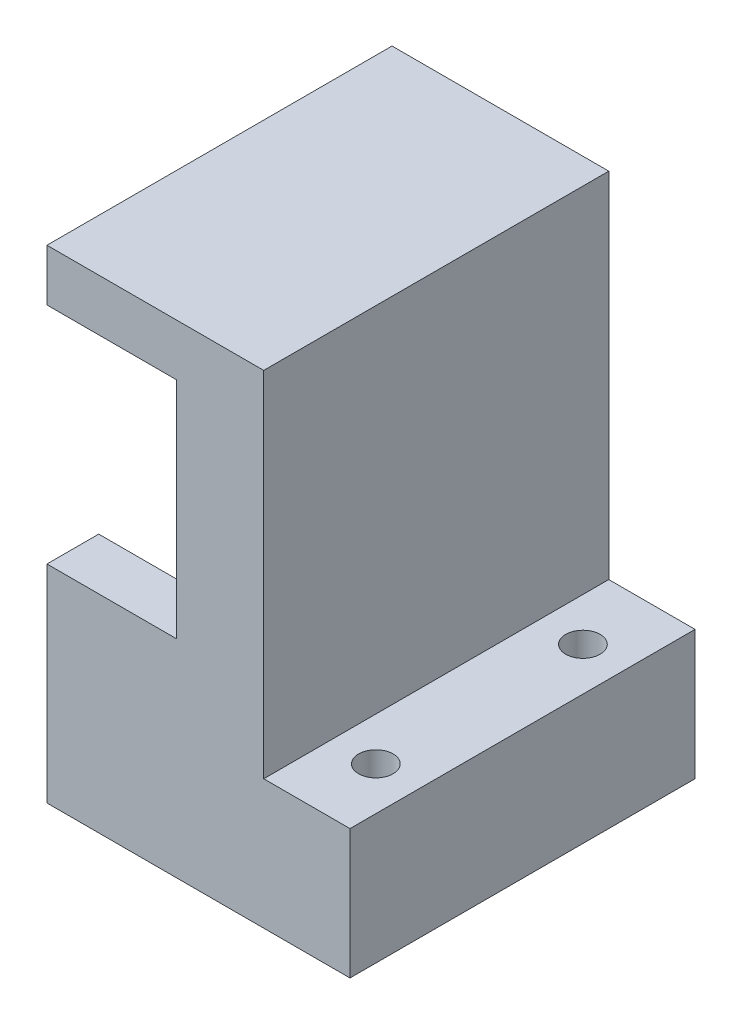
ISO-10303-21;
HEADER;
FILE_DESCRIPTION(('STEP AP214'),'2;1');
FILE_NAME('part.step','',(''),(''),'','','');
FILE_SCHEMA(('AUTOMOTIVE_DESIGN { 1 0 10303 214 1 1 1 1 }'));
ENDSEC;
DATA;
#1=APPLICATION_CONTEXT('core data for automotive mechanical design processes');
#2=APPLICATION_PROTOCOL_DEFINITION('international standard','automotive_design',2000,#1);
#3=PRODUCT_CONTEXT('',#1,'mechanical');
#4=PRODUCT('Part','Part','',(#3));
#5=PRODUCT_RELATED_PRODUCT_CATEGORY('part','',(#4));
#6=PRODUCT_DEFINITION_FORMATION('','',#4);
#7=PRODUCT_DEFINITION_CONTEXT('part definition',#1,'design');
#8=PRODUCT_DEFINITION('design','',#6,#7);
#9=PRODUCT_DEFINITION_SHAPE('','',#8);
#10=(LENGTH_UNIT() NAMED_UNIT(*) SI_UNIT(.MILLI.,.METRE.));
#11=(NAMED_UNIT(*) PLANE_ANGLE_UNIT() SI_UNIT($,.RADIAN.));
#12=(NAMED_UNIT(*) SI_UNIT($,.STERADIAN.) SOLID_ANGLE_UNIT());
#13=UNCERTAINTY_MEASURE_WITH_UNIT(LENGTH_MEASURE(1.E-05),#10,'distance_accuracy_value','');
#14=(GEOMETRIC_REPRESENTATION_CONTEXT(3) GLOBAL_UNCERTAINTY_ASSIGNED_CONTEXT((#13)) GLOBAL_UNIT_ASSIGNED_CONTEXT((#10,
#11,#12)) REPRESENTATION_CONTEXT('',''));
#15=CARTESIAN_POINT('',(0.,0.,0.));
#16=DIRECTION('',(0.,0.,1.));
#17=DIRECTION('',(1.,0.,0.));
#18=AXIS2_PLACEMENT_3D('',#15,#16,#17);
#19=CARTESIAN_POINT('',(0.,0.,40.));
#20=DIRECTION('',(0.,-1.,0.));
#21=DIRECTION('',(1.,0.,0.));
#22=AXIS2_PLACEMENT_3D('',#19,#20,#21);
#23=PLANE('',#22);
#24=DIRECTION('',(-1.,0.,0.));
#25=VECTOR('',#24,1.);
#26=CARTESIAN_POINT('',(0.,0.,0.));
#27=LINE('',#26,#25);
#28=CARTESIAN_POINT('',(10.1269659863946,0.,0.));
#29=VERTEX_POINT('',#28);
#30=CARTESIAN_POINT('',(-15.,0.,0.));
#31=VERTEX_POINT('',#30);
#32=EDGE_CURVE('E97',#29,#31,#27,.T.);
#33=ORIENTED_EDGE('',*,*,#32,.T.);
#34=DIRECTION('',(0.,0.,-1.));
#35=VECTOR('',#34,1.);
#36=CARTESIAN_POINT('',(-15.,0.,40.));
#37=LINE('',#36,#35);
#38=CARTESIAN_POINT('',(-15.,0.,40.));
#39=VERTEX_POINT('',#38);
#40=EDGE_CURVE('E11',#39,#31,#37,.T.);
#41=ORIENTED_EDGE('',*,*,#40,.F.);
#42=DIRECTION('',(-1.,0.,0.));
#43=VECTOR('',#42,1.);
#44=CARTESIAN_POINT('',(0.,0.,40.));
#45=LINE('',#44,#43);
#46=CARTESIAN_POINT('',(10.1269659863946,0.,40.));
#47=VERTEX_POINT('',#46);
#48=EDGE_CURVE('E103',#47,#39,#45,.T.);
#49=ORIENTED_EDGE('',*,*,#48,.F.);
#50=DIRECTION('',(0.,0.,-1.));
#51=VECTOR('',#50,1.);
#52=CARTESIAN_POINT('',(10.1269659863946,0.,40.));
#53=LINE('',#52,#51);
#54=EDGE_CURVE('E141',#47,#29,#53,.T.);
#55=ORIENTED_EDGE('',*,*,#54,.T.);
#56=EDGE_LOOP('',(#33,#41,#49,#55));
#57=FACE_BOUND('',#56,.T.);
#58=ADVANCED_FACE('F38',(#57),#23,.F.);
#59=CARTESIAN_POINT('',(-15.,-6.,40.));
#60=DIRECTION('',(1.,0.,0.));
#61=DIRECTION('',(0.,0.,-1.));
#62=AXIS2_PLACEMENT_3D('',#59,#60,#61);
#63=PLANE('',#62);
#64=DIRECTION('',(0.,-1.,0.));
#65=VECTOR('',#64,1.);
#66=CARTESIAN_POINT('',(-15.,-6.,0.));
#67=LINE('',#66,#65);
#68=CARTESIAN_POINT('',(-15.,-6.,0.));
#69=VERTEX_POINT('',#68);
#70=EDGE_CURVE('E146',#31,#69,#67,.T.);
#71=ORIENTED_EDGE('',*,*,#70,.T.);
#72=DIRECTION('',(0.,0.,-1.));
#73=VECTOR('',#72,1.);
#74=CARTESIAN_POINT('',(-15.,-6.,40.));
#75=LINE('',#74,#73);
#76=CARTESIAN_POINT('',(-15.,-6.,40.));
#77=VERTEX_POINT('',#76);
#78=EDGE_CURVE('E46',#77,#69,#75,.T.);
#79=ORIENTED_EDGE('',*,*,#78,.F.);
#80=DIRECTION('',(0.,-1.,0.));
#81=VECTOR('',#80,1.);
#82=CARTESIAN_POINT('',(-15.,-6.,40.));
#83=LINE('',#82,#81);
#84=EDGE_CURVE('E206',#39,#77,#83,.T.);
#85=ORIENTED_EDGE('',*,*,#84,.F.);
#86=ORIENTED_EDGE('',*,*,#40,.T.);
#87=EDGE_LOOP('',(#71,#79,#85,#86));
#88=FACE_BOUND('',#87,.T.);
#89=ADVANCED_FACE('F268',(#88),#63,.F.);
#90=CARTESIAN_POINT('',(0.,-6.,40.));
#91=DIRECTION('',(0.,1.,0.));
#92=DIRECTION('',(-1.,0.,0.));
#93=AXIS2_PLACEMENT_3D('',#90,#91,#92);
#94=PLANE('',#93);
#95=DIRECTION('',(1.,0.,0.));
#96=VECTOR('',#95,1.);
#97=CARTESIAN_POINT('',(0.,-6.,0.));
#98=LINE('',#97,#96);
#99=CARTESIAN_POINT('',(0.,-6.,0.));
#100=VERTEX_POINT('',#99);
#101=EDGE_CURVE('E149',#69,#100,#98,.T.);
#102=ORIENTED_EDGE('',*,*,#101,.T.);
#103=DIRECTION('',(0.,0.,-1.));
#104=VECTOR('',#103,1.);
#105=CARTESIAN_POINT('',(0.,-6.,40.));
#106=LINE('',#105,#104);
#107=CARTESIAN_POINT('',(0.,-6.,40.));
#108=VERTEX_POINT('',#107);
#109=EDGE_CURVE('E176',#108,#100,#106,.T.);
#110=ORIENTED_EDGE('',*,*,#109,.F.);
#111=DIRECTION('',(1.,0.,0.));
#112=VECTOR('',#111,1.);
#113=CARTESIAN_POINT('',(0.,-6.,40.));
#114=LINE('',#113,#112);
#115=EDGE_CURVE('E185',#77,#108,#114,.T.);
#116=ORIENTED_EDGE('',*,*,#115,.F.);
#117=ORIENTED_EDGE('',*,*,#78,.T.);
#118=EDGE_LOOP('',(#102,#110,#116,#117));
#119=FACE_BOUND('',#118,.T.);
#120=ADVANCED_FACE('F183',(#119),#94,.F.);
#121=CARTESIAN_POINT('',(0.,-41.,40.));
#122=DIRECTION('',(1.,0.,0.));
#123=DIRECTION('',(0.,0.,-1.));
#124=AXIS2_PLACEMENT_3D('',#121,#122,#123);
#125=PLANE('',#124);
#126=DIRECTION('',(0.,1.,0.));
#127=VECTOR('',#126,1.);
#128=CARTESIAN_POINT('',(0.,-32.,34.));
#129=LINE('',#128,#127);
#130=CARTESIAN_POINT('',(0.,-41.,34.));
#131=VERTEX_POINT('',#130);
#132=CARTESIAN_POINT('',(0.,-32.,34.));
#133=VERTEX_POINT('',#132);
#134=EDGE_CURVE('E229',#131,#133,#129,.T.);
#135=ORIENTED_EDGE('',*,*,#134,.T.);
#136=DIRECTION('',(0.,0.,1.));
#137=VECTOR('',#136,1.);
#138=CARTESIAN_POINT('',(0.,-32.,34.));
#139=LINE('',#138,#137);
#140=CARTESIAN_POINT('',(0.,-32.,40.));
#141=VERTEX_POINT('',#140);
#142=EDGE_CURVE('E201',#133,#141,#139,.T.);
#143=ORIENTED_EDGE('',*,*,#142,.T.);
#144=DIRECTION('',(0.,-1.,0.));
#145=VECTOR('',#144,1.);
#146=CARTESIAN_POINT('',(0.,-41.,40.));
#147=LINE('',#146,#145);
#148=EDGE_CURVE('E198',#108,#141,#147,.T.);
#149=ORIENTED_EDGE('',*,*,#148,.F.);
#150=ORIENTED_EDGE('',*,*,#109,.T.);
#151=DIRECTION('',(0.,-1.,0.));
#152=VECTOR('',#151,1.);
#153=CARTESIAN_POINT('',(0.,-41.,0.));
#154=LINE('',#153,#152);
#155=CARTESIAN_POINT('',(0.,-41.,0.));
#156=VERTEX_POINT('',#155);
#157=EDGE_CURVE('E151',#100,#156,#154,.T.);
#158=ORIENTED_EDGE('',*,*,#157,.T.);
#159=DIRECTION('',(0.,0.,-1.));
#160=VECTOR('',#159,1.);
#161=CARTESIAN_POINT('',(0.,-41.,40.));
#162=LINE('',#161,#160);
#163=EDGE_CURVE('E174',#131,#156,#162,.T.);
#164=ORIENTED_EDGE('',*,*,#163,.F.);
#165=EDGE_LOOP('',(#135,#143,#149,#150,#158,#164));
#166=FACE_BOUND('',#165,.T.);
#167=ADVANCED_FACE('F195',(#166),#125,.F.);
#168=CARTESIAN_POINT('',(-15.,-41.,40.));
#169=DIRECTION('',(0.,-1.,0.));
#170=DIRECTION('',(1.,0.,0.));
#171=AXIS2_PLACEMENT_3D('',#168,#169,#170);
#172=PLANE('',#171);
#173=DIRECTION('',(0.,0.,-1.));
#174=VECTOR('',#173,1.);
#175=CARTESIAN_POINT('',(-15.,-41.,40.));
#176=LINE('',#175,#174);
#177=CARTESIAN_POINT('',(-15.,-41.,34.));
#178=VERTEX_POINT('',#177);
#179=CARTESIAN_POINT('',(-15.,-41.,0.));
#180=VERTEX_POINT('',#179);
#181=EDGE_CURVE('E172',#178,#180,#176,.T.);
#182=ORIENTED_EDGE('',*,*,#181,.F.);
#183=DIRECTION('',(1.,0.,0.));
#184=VECTOR('',#183,1.);
#185=CARTESIAN_POINT('',(0.,-41.,34.));
#186=LINE('',#185,#184);
#187=EDGE_CURVE('E224',#178,#131,#186,.T.);
#188=ORIENTED_EDGE('',*,*,#187,.T.);
#189=ORIENTED_EDGE('',*,*,#163,.T.);
#190=DIRECTION('',(-1.,0.,0.));
#191=VECTOR('',#190,1.);
#192=CARTESIAN_POINT('',(-15.,-41.,0.));
#193=LINE('',#192,#191);
#194=EDGE_CURVE('E154',#156,#180,#193,.T.);
#195=ORIENTED_EDGE('',*,*,#194,.T.);
#196=EDGE_LOOP('',(#182,#188,#189,#195));
#197=FACE_BOUND('',#196,.T.);
#198=ADVANCED_FACE('F251',(#197),#172,.F.);
#199=CARTESIAN_POINT('',(-15.,-56.,40.));
#200=DIRECTION('',(1.,0.,0.));
#201=DIRECTION('',(0.,0.,-1.));
#202=AXIS2_PLACEMENT_3D('',#199,#200,#201);
#203=PLANE('',#202);
#204=DIRECTION('',(0.,-1.,0.));
#205=VECTOR('',#204,1.);
#206=CARTESIAN_POINT('',(-15.,-56.,0.));
#207=LINE('',#206,#205);
#208=CARTESIAN_POINT('',(-15.,-56.,0.));
#209=VERTEX_POINT('',#208);
#210=EDGE_CURVE('E157',#180,#209,#207,.T.);
#211=ORIENTED_EDGE('',*,*,#210,.T.);
#212=DIRECTION('',(0.,0.,-1.));
#213=VECTOR('',#212,1.);
#214=CARTESIAN_POINT('',(-15.,-56.,40.));
#215=LINE('',#214,#213);
#216=CARTESIAN_POINT('',(-15.,-56.,40.));
#217=VERTEX_POINT('',#216);
#218=EDGE_CURVE('E169',#217,#209,#215,.T.);
#219=ORIENTED_EDGE('',*,*,#218,.F.);
#220=DIRECTION('',(0.,-1.,0.));
#221=VECTOR('',#220,1.);
#222=CARTESIAN_POINT('',(-15.,-56.,40.));
#223=LINE('',#222,#221);
#224=CARTESIAN_POINT('',(-15.,-32.,40.));
#225=VERTEX_POINT('',#224);
#226=EDGE_CURVE('E203',#225,#217,#223,.T.);
#227=ORIENTED_EDGE('',*,*,#226,.F.);
#228=DIRECTION('',(0.,0.,1.));
#229=VECTOR('',#228,1.);
#230=CARTESIAN_POINT('',(-15.,-32.,34.));
#231=LINE('',#230,#229);
#232=CARTESIAN_POINT('',(-15.,-32.,34.));
#233=VERTEX_POINT('',#232);
#234=EDGE_CURVE('E220',#233,#225,#231,.T.);
#235=ORIENTED_EDGE('',*,*,#234,.F.);
#236=DIRECTION('',(0.,-1.,0.));
#237=VECTOR('',#236,1.);
#238=CARTESIAN_POINT('',(-15.,-32.,34.));
#239=LINE('',#238,#237);
#240=EDGE_CURVE('E232',#233,#178,#239,.T.);
#241=ORIENTED_EDGE('',*,*,#240,.T.);
#242=ORIENTED_EDGE('',*,*,#181,.T.);
#243=EDGE_LOOP('',(#211,#219,#227,#235,#241,#242));
#244=FACE_BOUND('',#243,.T.);
#245=ADVANCED_FACE('F254',(#244),#203,.F.);
#246=CARTESIAN_POINT('',(20.1269659863946,-56.,40.));
#247=DIRECTION('',(0.,1.,0.));
#248=DIRECTION('',(0.,0.,1.));
#249=AXIS2_PLACEMENT_3D('',#246,#247,#248);
#250=PLANE('',#249);
#251=CARTESIAN_POINT('',(15.1269659863946,-56.,8.));
#252=DIRECTION('',(0.,1.,0.));
#253=DIRECTION('',(0.,0.,1.));
#254=AXIS2_PLACEMENT_3D('',#251,#252,#253);
#255=CIRCLE('',#254,2.);
#256=CARTESIAN_POINT('',(15.1269659863946,-56.,10.));
#257=VERTEX_POINT('',#256);
#258=EDGE_CURVE('E147',#257,#257,#255,.T.);
#259=ORIENTED_EDGE('',*,*,#258,.T.);
#260=EDGE_LOOP('',(#259));
#261=FACE_BOUND('',#260,.T.);
#262=CARTESIAN_POINT('',(15.1269659863946,-56.,32.));
#263=DIRECTION('',(0.,1.,0.));
#264=DIRECTION('',(0.,0.,1.));
#265=AXIS2_PLACEMENT_3D('',#262,#263,#264);
#266=CIRCLE('',#265,2.00000000000001);
#267=CARTESIAN_POINT('',(15.1269659863946,-56.,34.));
#268=VERTEX_POINT('',#267);
#269=EDGE_CURVE('E213',#268,#268,#266,.T.);
#270=ORIENTED_EDGE('',*,*,#269,.T.);
#271=EDGE_LOOP('',(#270));
#272=FACE_BOUND('',#271,.T.);
#273=DIRECTION('',(1.,0.,0.));
#274=VECTOR('',#273,1.);
#275=CARTESIAN_POINT('',(20.1269659863946,-56.,0.));
#276=LINE('',#275,#274);
#277=CARTESIAN_POINT('',(20.1269659863946,-56.,0.));
#278=VERTEX_POINT('',#277);
#279=EDGE_CURVE('E159',#209,#278,#276,.T.);
#280=ORIENTED_EDGE('',*,*,#279,.T.);
#281=DIRECTION('',(0.,0.,-1.));
#282=VECTOR('',#281,1.);
#283=CARTESIAN_POINT('',(20.1269659863946,-56.,40.));
#284=LINE('',#283,#282);
#285=CARTESIAN_POINT('',(20.1269659863946,-56.,40.));
#286=VERTEX_POINT('',#285);
#287=EDGE_CURVE('E136',#286,#278,#284,.T.);
#288=ORIENTED_EDGE('',*,*,#287,.F.);
#289=DIRECTION('',(1.,0.,0.));
#290=VECTOR('',#289,1.);
#291=CARTESIAN_POINT('',(20.1269659863946,-56.,40.));
#292=LINE('',#291,#290);
#293=EDGE_CURVE('E127',#217,#286,#292,.T.);
#294=ORIENTED_EDGE('',*,*,#293,.F.);
#295=ORIENTED_EDGE('',*,*,#218,.T.);
#296=EDGE_LOOP('',(#280,#288,#294,#295));
#297=FACE_BOUND('',#296,.T.);
#298=ADVANCED_FACE('F264',(#261,#272,#297),#250,.F.);
#299=CARTESIAN_POINT('',(20.1269659863946,-41.,40.));
#300=DIRECTION('',(-1.,0.,0.));
#301=DIRECTION('',(0.,0.,1.));
#302=AXIS2_PLACEMENT_3D('',#299,#300,#301);
#303=PLANE('',#302);
#304=DIRECTION('',(0.,1.,0.));
#305=VECTOR('',#304,1.);
#306=CARTESIAN_POINT('',(20.1269659863946,-41.,0.));
#307=LINE('',#306,#305);
#308=CARTESIAN_POINT('',(20.1269659863946,-41.,0.));
#309=VERTEX_POINT('',#308);
#310=EDGE_CURVE('E135',#278,#309,#307,.T.);
#311=ORIENTED_EDGE('',*,*,#310,.T.);
#312=DIRECTION('',(0.,0.,-1.));
#313=VECTOR('',#312,1.);
#314=CARTESIAN_POINT('',(20.1269659863946,-41.,40.));
#315=LINE('',#314,#313);
#316=CARTESIAN_POINT('',(20.1269659863946,-41.,40.));
#317=VERTEX_POINT('',#316);
#318=EDGE_CURVE('E132',#317,#309,#315,.T.);
#319=ORIENTED_EDGE('',*,*,#318,.F.);
#320=DIRECTION('',(0.,1.,0.));
#321=VECTOR('',#320,1.);
#322=CARTESIAN_POINT('',(20.1269659863946,-41.,40.));
#323=LINE('',#322,#321);
#324=EDGE_CURVE('E120',#286,#317,#323,.T.);
#325=ORIENTED_EDGE('',*,*,#324,.F.);
#326=ORIENTED_EDGE('',*,*,#287,.T.);
#327=EDGE_LOOP('',(#311,#319,#325,#326));
#328=FACE_BOUND('',#327,.T.);
#329=ADVANCED_FACE('F133',(#328),#303,.F.);
#330=CARTESIAN_POINT('',(10.1269659863946,-41.,40.));
#331=DIRECTION('',(0.,-1.,0.));
#332=DIRECTION('',(0.,0.,-1.));
#333=AXIS2_PLACEMENT_3D('',#330,#331,#332);
#334=PLANE('',#333);
#335=CARTESIAN_POINT('',(15.1269659863946,-41.,8.));
#336=DIRECTION('',(0.,1.,0.));
#337=DIRECTION('',(0.,0.,1.));
#338=AXIS2_PLACEMENT_3D('',#335,#336,#337);
#339=CIRCLE('',#338,2.);
#340=CARTESIAN_POINT('',(15.1269659863946,-41.,10.));
#341=VERTEX_POINT('',#340);
#342=EDGE_CURVE('E216',#341,#341,#339,.T.);
#343=ORIENTED_EDGE('',*,*,#342,.F.);
#344=EDGE_LOOP('',(#343));
#345=FACE_BOUND('',#344,.T.);
#346=CARTESIAN_POINT('',(15.1269659863946,-41.,32.));
#347=DIRECTION('',(0.,1.,0.));
#348=DIRECTION('',(0.,0.,1.));
#349=AXIS2_PLACEMENT_3D('',#346,#347,#348);
#350=CIRCLE('',#349,2.00000000000001);
#351=CARTESIAN_POINT('',(15.1269659863946,-41.,34.));
#352=VERTEX_POINT('',#351);
#353=EDGE_CURVE('E217',#352,#352,#350,.T.);
#354=ORIENTED_EDGE('',*,*,#353,.F.);
#355=EDGE_LOOP('',(#354));
#356=FACE_BOUND('',#355,.T.);
#357=DIRECTION('',(-1.,0.,0.));
#358=VECTOR('',#357,1.);
#359=CARTESIAN_POINT('',(10.1269659863946,-41.,0.));
#360=LINE('',#359,#358);
#361=CARTESIAN_POINT('',(10.1269659863946,-41.,0.));
#362=VERTEX_POINT('',#361);
#363=EDGE_CURVE('E90',#309,#362,#360,.T.);
#364=ORIENTED_EDGE('',*,*,#363,.T.);
#365=DIRECTION('',(0.,0.,-1.));
#366=VECTOR('',#365,1.);
#367=CARTESIAN_POINT('',(10.1269659863946,-41.,40.));
#368=LINE('',#367,#366);
#369=CARTESIAN_POINT('',(10.1269659863946,-41.,40.));
#370=VERTEX_POINT('',#369);
#371=EDGE_CURVE('E137',#370,#362,#368,.T.);
#372=ORIENTED_EDGE('',*,*,#371,.F.);
#373=DIRECTION('',(-1.,0.,0.));
#374=VECTOR('',#373,1.);
#375=CARTESIAN_POINT('',(10.1269659863946,-41.,40.));
#376=LINE('',#375,#374);
#377=EDGE_CURVE('E125',#317,#370,#376,.T.);
#378=ORIENTED_EDGE('',*,*,#377,.F.);
#379=ORIENTED_EDGE('',*,*,#318,.T.);
#380=EDGE_LOOP('',(#364,#372,#378,#379));
#381=FACE_BOUND('',#380,.T.);
#382=ADVANCED_FACE('F139',(#345,#356,#381),#334,.F.);
#383=CARTESIAN_POINT('',(10.1269659863946,0.,40.));
#384=DIRECTION('',(-1.,0.,0.));
#385=DIRECTION('',(0.,-1.,0.));
#386=AXIS2_PLACEMENT_3D('',#383,#384,#385);
#387=PLANE('',#386);
#388=DIRECTION('',(0.,1.,0.));
#389=VECTOR('',#388,1.);
#390=CARTESIAN_POINT('',(10.1269659863946,0.,0.));
#391=LINE('',#390,#389);
#392=EDGE_CURVE('E163',#362,#29,#391,.T.);
#393=ORIENTED_EDGE('',*,*,#392,.T.);
#394=ORIENTED_EDGE('',*,*,#54,.F.);
#395=DIRECTION('',(0.,1.,0.));
#396=VECTOR('',#395,1.);
#397=CARTESIAN_POINT('',(10.1269659863946,0.,40.));
#398=LINE('',#397,#396);
#399=EDGE_CURVE('E54',#370,#47,#398,.T.);
#400=ORIENTED_EDGE('',*,*,#399,.F.);
#401=ORIENTED_EDGE('',*,*,#371,.T.);
#402=EDGE_LOOP('',(#393,#394,#400,#401));
#403=FACE_BOUND('',#402,.T.);
#404=ADVANCED_FACE('F266',(#403),#387,.F.);
#405=CARTESIAN_POINT('',(0.,0.,40.));
#406=DIRECTION('',(0.,0.,-1.));
#407=DIRECTION('',(-1.,0.,0.));
#408=AXIS2_PLACEMENT_3D('',#405,#406,#407);
#409=PLANE('',#408);
#410=ORIENTED_EDGE('',*,*,#148,.T.);
#411=DIRECTION('',(-1.,0.,0.));
#412=VECTOR('',#411,1.);
#413=CARTESIAN_POINT('',(0.,-32.,40.));
#414=LINE('',#413,#412);
#415=EDGE_CURVE('E227',#141,#225,#414,.T.);
#416=ORIENTED_EDGE('',*,*,#415,.T.);
#417=ORIENTED_EDGE('',*,*,#226,.T.);
#418=ORIENTED_EDGE('',*,*,#293,.T.);
#419=ORIENTED_EDGE('',*,*,#324,.T.);
#420=ORIENTED_EDGE('',*,*,#377,.T.);
#421=ORIENTED_EDGE('',*,*,#399,.T.);
#422=ORIENTED_EDGE('',*,*,#48,.T.);
#423=ORIENTED_EDGE('',*,*,#84,.T.);
#424=ORIENTED_EDGE('',*,*,#115,.T.);
#425=EDGE_LOOP('',(#410,#416,#417,#418,#419,#420,#421,#422,#423,#424));
#426=FACE_BOUND('',#425,.T.);
#427=ADVANCED_FACE('F123',(#426),#409,.F.);
#428=CARTESIAN_POINT('',(0.,0.,0.));
#429=DIRECTION('',(0.,0.,-1.));
#430=DIRECTION('',(-1.,0.,0.));
#431=AXIS2_PLACEMENT_3D('',#428,#429,#430);
#432=PLANE('',#431);
#433=ORIENTED_EDGE('',*,*,#32,.F.);
#434=ORIENTED_EDGE('',*,*,#392,.F.);
#435=ORIENTED_EDGE('',*,*,#363,.F.);
#436=ORIENTED_EDGE('',*,*,#310,.F.);
#437=ORIENTED_EDGE('',*,*,#279,.F.);
#438=ORIENTED_EDGE('',*,*,#210,.F.);
#439=ORIENTED_EDGE('',*,*,#194,.F.);
#440=ORIENTED_EDGE('',*,*,#157,.F.);
#441=ORIENTED_EDGE('',*,*,#101,.F.);
#442=ORIENTED_EDGE('',*,*,#70,.F.);
#443=EDGE_LOOP('',(#433,#434,#435,#436,#437,#438,#439,#440,#441,#442));
#444=FACE_BOUND('',#443,.T.);
#445=ADVANCED_FACE('F189',(#444),#432,.T.);
#446=CARTESIAN_POINT('',(15.1269659863946,-70.,32.));
#447=DIRECTION('',(0.,1.,0.));
#448=DIRECTION('',(0.,0.,1.));
#449=AXIS2_PLACEMENT_3D('',#446,#447,#448);
#450=CYLINDRICAL_SURFACE('',#449,2.00000000000001);
#451=ORIENTED_EDGE('',*,*,#353,.T.);
#452=EDGE_LOOP('',(#451));
#453=FACE_BOUND('',#452,.T.);
#454=ORIENTED_EDGE('',*,*,#269,.F.);
#455=EDGE_LOOP('',(#454));
#456=FACE_BOUND('',#455,.T.);
#457=ADVANCED_FACE('F294',(#453,#456),#450,.F.);
#458=CARTESIAN_POINT('',(15.1269659863946,-70.,8.));
#459=DIRECTION('',(0.,1.,0.));
#460=DIRECTION('',(0.,0.,1.));
#461=AXIS2_PLACEMENT_3D('',#458,#459,#460);
#462=CYLINDRICAL_SURFACE('',#461,2.);
#463=ORIENTED_EDGE('',*,*,#342,.T.);
#464=EDGE_LOOP('',(#463));
#465=FACE_BOUND('',#464,.T.);
#466=ORIENTED_EDGE('',*,*,#258,.F.);
#467=EDGE_LOOP('',(#466));
#468=FACE_BOUND('',#467,.T.);
#469=ADVANCED_FACE('F299',(#465,#468),#462,.F.);
#470=CARTESIAN_POINT('',(0.,-32.,34.));
#471=DIRECTION('',(0.,1.,0.));
#472=DIRECTION('',(0.,0.,1.));
#473=AXIS2_PLACEMENT_3D('',#470,#471,#472);
#474=PLANE('',#473);
#475=ORIENTED_EDGE('',*,*,#415,.F.);
#476=ORIENTED_EDGE('',*,*,#142,.F.);
#477=DIRECTION('',(-1.,0.,0.));
#478=VECTOR('',#477,1.);
#479=CARTESIAN_POINT('',(0.,-32.,34.));
#480=LINE('',#479,#478);
#481=EDGE_CURVE('E235',#133,#233,#480,.T.);
#482=ORIENTED_EDGE('',*,*,#481,.T.);
#483=ORIENTED_EDGE('',*,*,#234,.T.);
#484=EDGE_LOOP('',(#475,#476,#482,#483));
#485=FACE_BOUND('',#484,.T.);
#486=ADVANCED_FACE('F261',(#485),#474,.T.);
#487=CARTESIAN_POINT('',(0.,0.,34.));
#488=DIRECTION('',(0.,0.,-1.));
#489=DIRECTION('',(-1.,0.,0.));
#490=AXIS2_PLACEMENT_3D('',#487,#488,#489);
#491=PLANE('',#490);
#492=ORIENTED_EDGE('',*,*,#134,.F.);
#493=ORIENTED_EDGE('',*,*,#187,.F.);
#494=ORIENTED_EDGE('',*,*,#240,.F.);
#495=ORIENTED_EDGE('',*,*,#481,.F.);
#496=EDGE_LOOP('',(#492,#493,#494,#495));
#497=FACE_BOUND('',#496,.T.);
#498=ADVANCED_FACE('F245',(#497),#491,.T.);
#499=CLOSED_SHELL('',(#58,#89,#120,#167,#198,#245,#298,#329,#382,#404,#427,#445,#457,#469,#486,#498));
#500=MANIFOLD_SOLID_BREP('B2',#499);
#501=ADVANCED_BREP_SHAPE_REPRESENTATION('',(#18,#500),#14);
#502=SHAPE_DEFINITION_REPRESENTATION(#9,#501);
ENDSEC;
END-ISO-10303-21;
